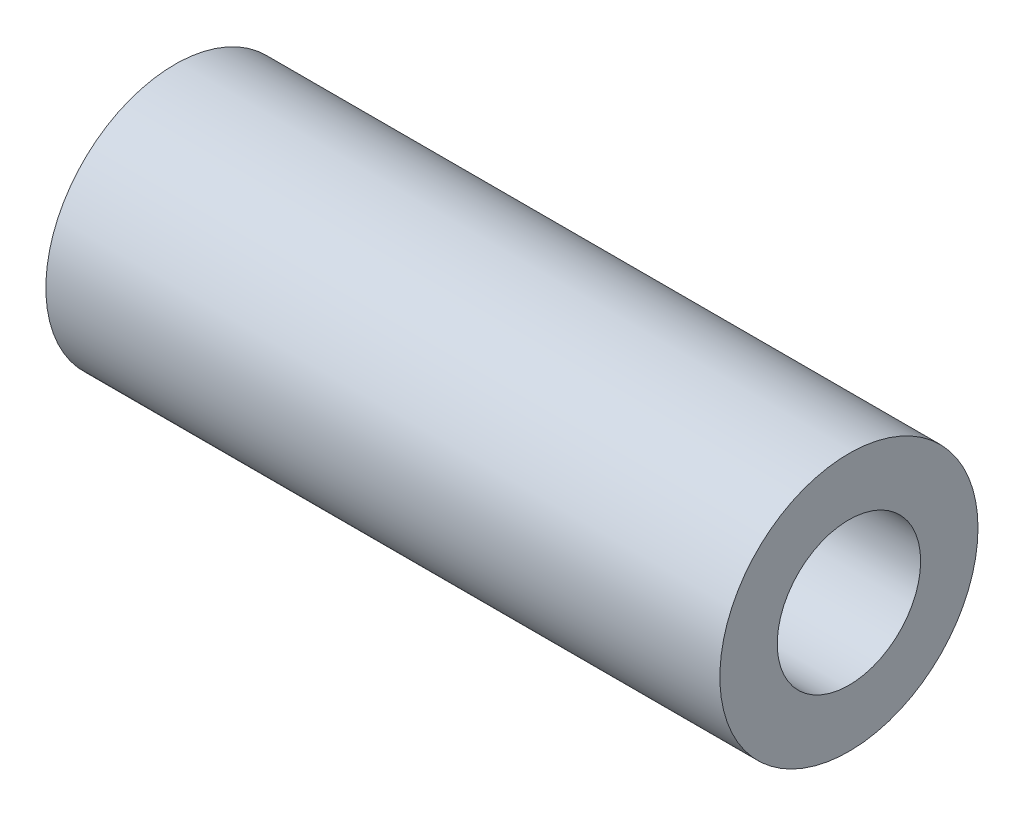
ISO-10303-21;
HEADER;
FILE_DESCRIPTION(('STEP AP214'),'2;1');
FILE_NAME('part.step','',(''),(''),'','','');
FILE_SCHEMA(('AUTOMOTIVE_DESIGN { 1 0 10303 214 1 1 1 1 }'));
ENDSEC;
DATA;
#1=APPLICATION_CONTEXT('core data for automotive mechanical design processes');
#2=APPLICATION_PROTOCOL_DEFINITION('international standard','automotive_design',2000,#1);
#3=PRODUCT_CONTEXT('',#1,'mechanical');
#4=PRODUCT('Part','Part','',(#3));
#5=PRODUCT_RELATED_PRODUCT_CATEGORY('part','',(#4));
#6=PRODUCT_DEFINITION_FORMATION('','',#4);
#7=PRODUCT_DEFINITION_CONTEXT('part definition',#1,'design');
#8=PRODUCT_DEFINITION('design','',#6,#7);
#9=PRODUCT_DEFINITION_SHAPE('','',#8);
#10=(LENGTH_UNIT() NAMED_UNIT(*) SI_UNIT(.MILLI.,.METRE.));
#11=(NAMED_UNIT(*) PLANE_ANGLE_UNIT() SI_UNIT($,.RADIAN.));
#12=(NAMED_UNIT(*) SI_UNIT($,.STERADIAN.) SOLID_ANGLE_UNIT());
#13=UNCERTAINTY_MEASURE_WITH_UNIT(LENGTH_MEASURE(1.E-05),#10,'distance_accuracy_value','');
#14=(GEOMETRIC_REPRESENTATION_CONTEXT(3) GLOBAL_UNCERTAINTY_ASSIGNED_CONTEXT((#13)) GLOBAL_UNIT_ASSIGNED_CONTEXT((#10,
#11,#12)) REPRESENTATION_CONTEXT('',''));
#15=CARTESIAN_POINT('',(0.,0.,0.));
#16=DIRECTION('',(0.,0.,1.));
#17=DIRECTION('',(1.,0.,0.));
#18=AXIS2_PLACEMENT_3D('',#15,#16,#17);
#19=CARTESIAN_POINT('',(23.5,0.,0.));
#20=DIRECTION('',(1.,0.,0.));
#21=DIRECTION('',(0.,0.,-1.));
#22=AXIS2_PLACEMENT_3D('',#19,#20,#21);
#23=PLANE('',#22);
#24=CARTESIAN_POINT('',(23.5,0.,0.));
#25=DIRECTION('',(1.,0.,0.));
#26=DIRECTION('',(0.,0.,-1.));
#27=AXIS2_PLACEMENT_3D('',#24,#25,#26);
#28=CIRCLE('',#27,4.5);
#29=CARTESIAN_POINT('',(23.5,0.,-4.5));
#30=VERTEX_POINT('',#29);
#31=EDGE_CURVE('E10',#30,#30,#28,.T.);
#32=ORIENTED_EDGE('',*,*,#31,.T.);
#33=EDGE_LOOP('',(#32));
#34=FACE_BOUND('',#33,.T.);
#35=CARTESIAN_POINT('',(23.5,0.,0.));
#36=DIRECTION('',(1.,0.,0.));
#37=DIRECTION('',(0.,0.,-1.));
#38=AXIS2_PLACEMENT_3D('',#35,#36,#37);
#39=CIRCLE('',#38,2.5);
#40=CARTESIAN_POINT('',(23.5,0.,-2.5));
#41=VERTEX_POINT('',#40);
#42=EDGE_CURVE('E54',#41,#41,#39,.T.);
#43=ORIENTED_EDGE('',*,*,#42,.F.);
#44=EDGE_LOOP('',(#43));
#45=FACE_BOUND('',#44,.T.);
#46=ADVANCED_FACE('F41',(#34,#45),#23,.T.);
#47=CARTESIAN_POINT('',(0.,0.,0.));
#48=DIRECTION('',(1.,0.,0.));
#49=DIRECTION('',(0.,0.,-1.));
#50=AXIS2_PLACEMENT_3D('',#47,#48,#49);
#51=PLANE('',#50);
#52=CARTESIAN_POINT('',(0.,0.,0.));
#53=DIRECTION('',(1.,0.,0.));
#54=DIRECTION('',(0.,0.,-1.));
#55=AXIS2_PLACEMENT_3D('',#52,#53,#54);
#56=CIRCLE('',#55,4.5);
#57=CARTESIAN_POINT('',(0.,0.,-4.5));
#58=VERTEX_POINT('',#57);
#59=EDGE_CURVE('E45',#58,#58,#56,.T.);
#60=ORIENTED_EDGE('',*,*,#59,.F.);
#61=EDGE_LOOP('',(#60));
#62=FACE_BOUND('',#61,.T.);
#63=CARTESIAN_POINT('',(0.,0.,0.));
#64=DIRECTION('',(1.,0.,0.));
#65=DIRECTION('',(0.,0.,-1.));
#66=AXIS2_PLACEMENT_3D('',#63,#64,#65);
#67=CIRCLE('',#66,2.5);
#68=CARTESIAN_POINT('',(0.,0.,-2.5));
#69=VERTEX_POINT('',#68);
#70=EDGE_CURVE('E56',#69,#69,#67,.T.);
#71=ORIENTED_EDGE('',*,*,#70,.T.);
#72=EDGE_LOOP('',(#71));
#73=FACE_BOUND('',#72,.T.);
#74=ADVANCED_FACE('F68',(#62,#73),#51,.F.);
#75=CARTESIAN_POINT('',(23.5,0.,0.));
#76=DIRECTION('',(-1.,0.,0.));
#77=DIRECTION('',(0.,0.,1.));
#78=AXIS2_PLACEMENT_3D('',#75,#76,#77);
#79=CYLINDRICAL_SURFACE('',#78,4.5);
#80=ORIENTED_EDGE('',*,*,#31,.F.);
#81=EDGE_LOOP('',(#80));
#82=FACE_BOUND('',#81,.T.);
#83=ORIENTED_EDGE('',*,*,#59,.T.);
#84=EDGE_LOOP('',(#83));
#85=FACE_BOUND('',#84,.T.);
#86=ADVANCED_FACE('F43',(#82,#85),#79,.T.);
#87=CARTESIAN_POINT('',(23.5,0.,0.));
#88=DIRECTION('',(-1.,0.,0.));
#89=DIRECTION('',(0.,0.,1.));
#90=AXIS2_PLACEMENT_3D('',#87,#88,#89);
#91=CYLINDRICAL_SURFACE('',#90,2.5);
#92=ORIENTED_EDGE('',*,*,#42,.T.);
#93=EDGE_LOOP('',(#92));
#94=FACE_BOUND('',#93,.T.);
#95=ORIENTED_EDGE('',*,*,#70,.F.);
#96=EDGE_LOOP('',(#95));
#97=FACE_BOUND('',#96,.T.);
#98=ADVANCED_FACE('F64',(#94,#97),#91,.F.);
#99=CLOSED_SHELL('',(#46,#74,#86,#98));
#100=MANIFOLD_SOLID_BREP('B2',#99);
#101=ADVANCED_BREP_SHAPE_REPRESENTATION('',(#18,#100),#14);
#102=SHAPE_DEFINITION_REPRESENTATION(#9,#101);
ENDSEC;
END-ISO-10303-21;
